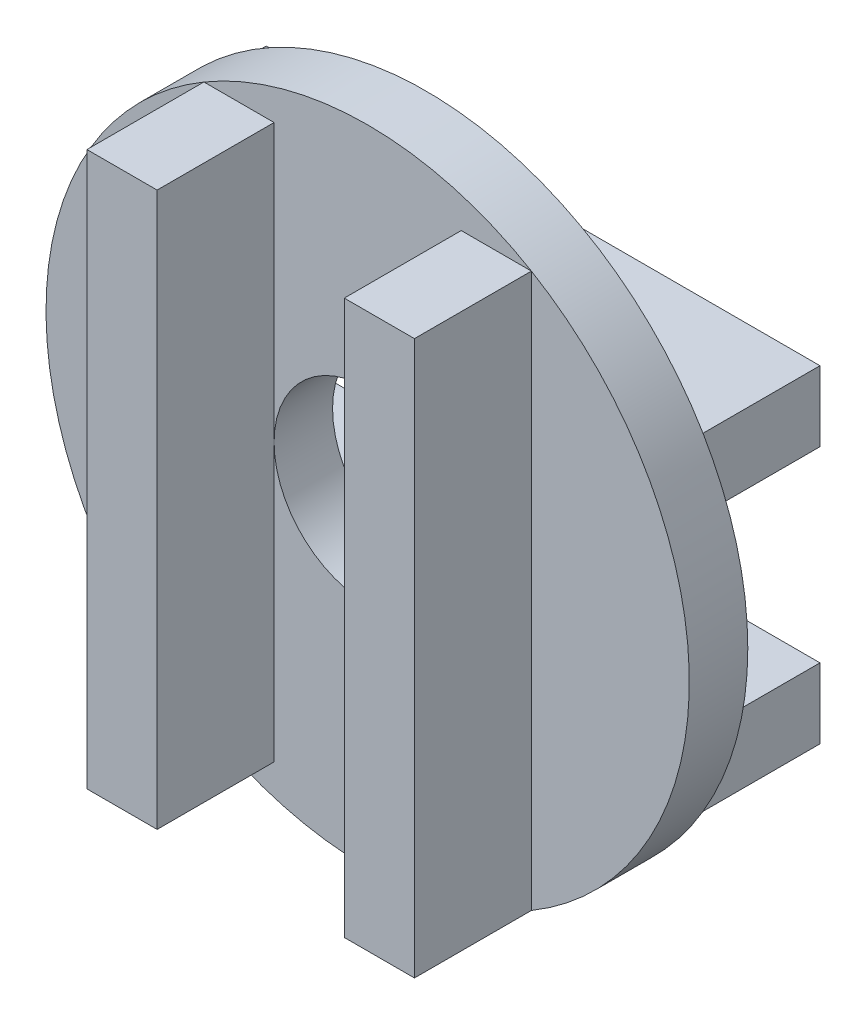
ISO-10303-21;
HEADER;
FILE_DESCRIPTION(('STEP AP214'),'2;1');
FILE_NAME('part.step','',(''),(''),'','','');
FILE_SCHEMA(('AUTOMOTIVE_DESIGN { 1 0 10303 214 1 1 1 1 }'));
ENDSEC;
DATA;
#1=APPLICATION_CONTEXT('core data for automotive mechanical design processes');
#2=APPLICATION_PROTOCOL_DEFINITION('international standard','automotive_design',2000,#1);
#3=PRODUCT_CONTEXT('',#1,'mechanical');
#4=PRODUCT('Part','Part','',(#3));
#5=PRODUCT_RELATED_PRODUCT_CATEGORY('part','',(#4));
#6=PRODUCT_DEFINITION_FORMATION('','',#4);
#7=PRODUCT_DEFINITION_CONTEXT('part definition',#1,'design');
#8=PRODUCT_DEFINITION('design','',#6,#7);
#9=PRODUCT_DEFINITION_SHAPE('','',#8);
#10=(LENGTH_UNIT() NAMED_UNIT(*) SI_UNIT(.MILLI.,.METRE.));
#11=(NAMED_UNIT(*) PLANE_ANGLE_UNIT() SI_UNIT($,.RADIAN.));
#12=(NAMED_UNIT(*) SI_UNIT($,.STERADIAN.) SOLID_ANGLE_UNIT());
#13=UNCERTAINTY_MEASURE_WITH_UNIT(LENGTH_MEASURE(1.E-05),#10,'distance_accuracy_value','');
#14=(GEOMETRIC_REPRESENTATION_CONTEXT(3) GLOBAL_UNCERTAINTY_ASSIGNED_CONTEXT((#13)) GLOBAL_UNIT_ASSIGNED_CONTEXT((#10,
#11,#12)) REPRESENTATION_CONTEXT('',''));
#15=CARTESIAN_POINT('',(0.,0.,0.));
#16=DIRECTION('',(0.,0.,1.));
#17=DIRECTION('',(1.,0.,0.));
#18=AXIS2_PLACEMENT_3D('',#15,#16,#17);
#19=CARTESIAN_POINT('',(0.,0.,0.));
#20=DIRECTION('',(0.,0.,1.));
#21=DIRECTION('',(1.,0.,0.));
#22=AXIS2_PLACEMENT_3D('',#19,#20,#21);
#23=PLANE('',#22);
#24=DIRECTION('',(0.,-1.,0.));
#25=VECTOR('',#24,1.);
#26=CARTESIAN_POINT('',(47.3392015141785,-28.,0.));
#27=LINE('',#26,#25);
#28=CARTESIAN_POINT('',(47.3392015141785,-16.,0.));
#29=VERTEX_POINT('',#28);
#30=CARTESIAN_POINT('',(47.3392015141785,-28.,0.));
#31=VERTEX_POINT('',#30);
#32=EDGE_CURVE('E173',#29,#31,#27,.T.);
#33=ORIENTED_EDGE('',*,*,#32,.F.);
#34=DIRECTION('',(1.,0.,0.));
#35=VECTOR('',#34,1.);
#36=CARTESIAN_POINT('',(47.3392015141785,-16.,0.));
#37=LINE('',#36,#35);
#38=CARTESIAN_POINT('',(0.,-16.,0.));
#39=VERTEX_POINT('',#38);
#40=EDGE_CURVE('E175',#39,#29,#37,.T.);
#41=ORIENTED_EDGE('',*,*,#40,.F.);
#42=CARTESIAN_POINT('',(0.,0.,0.));
#43=DIRECTION('',(0.,0.,1.));
#44=DIRECTION('',(1.,0.,0.));
#45=AXIS2_PLACEMENT_3D('',#42,#43,#44);
#46=CIRCLE('',#45,16.);
#47=CARTESIAN_POINT('',(0.,16.,0.));
#48=VERTEX_POINT('',#47);
#49=EDGE_CURVE('E352',#39,#48,#46,.T.);
#50=ORIENTED_EDGE('',*,*,#49,.T.);
#51=DIRECTION('',(-1.,0.,0.));
#52=VECTOR('',#51,1.);
#53=CARTESIAN_POINT('',(47.3392015141785,16.,0.));
#54=LINE('',#53,#52);
#55=CARTESIAN_POINT('',(47.3392015141785,16.,0.));
#56=VERTEX_POINT('',#55);
#57=EDGE_CURVE('E55',#56,#48,#54,.T.);
#58=ORIENTED_EDGE('',*,*,#57,.F.);
#59=DIRECTION('',(0.,-1.,0.));
#60=VECTOR('',#59,1.);
#61=CARTESIAN_POINT('',(47.3392015141785,28.,0.));
#62=LINE('',#61,#60);
#63=CARTESIAN_POINT('',(47.3392015141785,28.,0.));
#64=VERTEX_POINT('',#63);
#65=EDGE_CURVE('E184',#64,#56,#62,.T.);
#66=ORIENTED_EDGE('',*,*,#65,.F.);
#67=CARTESIAN_POINT('',(0.,0.,0.));
#68=DIRECTION('',(0.,0.,1.));
#69=DIRECTION('',(1.,0.,0.));
#70=AXIS2_PLACEMENT_3D('',#67,#68,#69);
#71=CIRCLE('',#70,55.);
#72=EDGE_CURVE('E178',#31,#64,#71,.T.);
#73=ORIENTED_EDGE('',*,*,#72,.F.);
#74=EDGE_LOOP('',(#33,#41,#50,#58,#66,#73));
#75=FACE_BOUND('',#74,.T.);
#76=ADVANCED_FACE('F43',(#75),#23,.F.);
#77=DIRECTION('',(-1.,0.,0.));
#78=VECTOR('',#77,1.);
#79=CARTESIAN_POINT('',(47.3392015141785,-28.,0.));
#80=LINE('',#79,#78);
#81=CARTESIAN_POINT('',(-47.3392015141785,-28.,0.));
#82=VERTEX_POINT('',#81);
#83=EDGE_CURVE('E69',#31,#82,#80,.T.);
#84=ORIENTED_EDGE('',*,*,#83,.F.);
#85=EDGE_CURVE('E386',#82,#31,#71,.T.);
#86=ORIENTED_EDGE('',*,*,#85,.F.);
#87=EDGE_LOOP('',(#84,#86));
#88=FACE_BOUND('',#87,.T.);
#89=ADVANCED_FACE('F413',(#88),#23,.F.);
#90=DIRECTION('',(0.,1.,0.));
#91=VECTOR('',#90,1.);
#92=CARTESIAN_POINT('',(-47.3392015141785,-28.,0.));
#93=LINE('',#92,#91);
#94=CARTESIAN_POINT('',(-47.3392015141785,-16.,0.));
#95=VERTEX_POINT('',#94);
#96=EDGE_CURVE('E211',#82,#95,#93,.T.);
#97=ORIENTED_EDGE('',*,*,#96,.F.);
#98=CARTESIAN_POINT('',(-47.3392015141785,28.,0.));
#99=VERTEX_POINT('',#98);
#100=EDGE_CURVE('E381',#99,#82,#71,.T.);
#101=ORIENTED_EDGE('',*,*,#100,.F.);
#102=DIRECTION('',(0.,1.,0.));
#103=VECTOR('',#102,1.);
#104=CARTESIAN_POINT('',(-47.3392015141785,28.,0.));
#105=LINE('',#104,#103);
#106=CARTESIAN_POINT('',(-47.3392015141785,16.,0.));
#107=VERTEX_POINT('',#106);
#108=EDGE_CURVE('E243',#107,#99,#105,.T.);
#109=ORIENTED_EDGE('',*,*,#108,.F.);
#110=EDGE_CURVE('E11',#48,#107,#54,.T.);
#111=ORIENTED_EDGE('',*,*,#110,.F.);
#112=EDGE_CURVE('E358',#48,#39,#46,.T.);
#113=ORIENTED_EDGE('',*,*,#112,.T.);
#114=EDGE_CURVE('E62',#95,#39,#37,.T.);
#115=ORIENTED_EDGE('',*,*,#114,.F.);
#116=EDGE_LOOP('',(#97,#101,#109,#111,#113,#115));
#117=FACE_BOUND('',#116,.T.);
#118=ADVANCED_FACE('F418',(#117),#23,.F.);
#119=DIRECTION('',(1.,0.,0.));
#120=VECTOR('',#119,1.);
#121=CARTESIAN_POINT('',(47.3392015141785,28.,0.));
#122=LINE('',#121,#120);
#123=EDGE_CURVE('E228',#99,#64,#122,.T.);
#124=ORIENTED_EDGE('',*,*,#123,.F.);
#125=EDGE_CURVE('E47',#64,#99,#71,.T.);
#126=ORIENTED_EDGE('',*,*,#125,.F.);
#127=EDGE_LOOP('',(#124,#126));
#128=FACE_BOUND('',#127,.T.);
#129=ADVANCED_FACE('F414',(#128),#23,.F.);
#130=CARTESIAN_POINT('',(0.,0.,10.));
#131=DIRECTION('',(0.,0.,1.));
#132=DIRECTION('',(1.,0.,0.));
#133=AXIS2_PLACEMENT_3D('',#130,#131,#132);
#134=PLANE('',#133);
#135=DIRECTION('',(-1.,0.,0.));
#136=VECTOR('',#135,1.);
#137=CARTESIAN_POINT('',(-16.,47.3392015141785,10.));
#138=LINE('',#137,#136);
#139=CARTESIAN_POINT('',(-16.,47.3392015141785,10.));
#140=VERTEX_POINT('',#139);
#141=CARTESIAN_POINT('',(-28.,47.3392015141785,10.));
#142=VERTEX_POINT('',#141);
#143=EDGE_CURVE('E289',#140,#142,#138,.T.);
#144=ORIENTED_EDGE('',*,*,#143,.F.);
#145=DIRECTION('',(0.,1.,0.));
#146=VECTOR('',#145,1.);
#147=CARTESIAN_POINT('',(-16.,47.3392015141785,10.));
#148=LINE('',#147,#146);
#149=CARTESIAN_POINT('',(-16.,0.,10.));
#150=VERTEX_POINT('',#149);
#151=EDGE_CURVE('E292',#150,#140,#148,.T.);
#152=ORIENTED_EDGE('',*,*,#151,.F.);
#153=CARTESIAN_POINT('',(0.,0.,10.));
#154=DIRECTION('',(0.,0.,1.));
#155=DIRECTION('',(1.,0.,0.));
#156=AXIS2_PLACEMENT_3D('',#153,#154,#155);
#157=CIRCLE('',#156,16.);
#158=CARTESIAN_POINT('',(16.,0.,10.));
#159=VERTEX_POINT('',#158);
#160=EDGE_CURVE('E353',#159,#150,#157,.T.);
#161=ORIENTED_EDGE('',*,*,#160,.F.);
#162=DIRECTION('',(0.,-1.,0.));
#163=VECTOR('',#162,1.);
#164=CARTESIAN_POINT('',(16.,47.3392015141785,10.));
#165=LINE('',#164,#163);
#166=CARTESIAN_POINT('',(16.,47.3392015141785,10.));
#167=VERTEX_POINT('',#166);
#168=EDGE_CURVE('E296',#167,#159,#165,.T.);
#169=ORIENTED_EDGE('',*,*,#168,.F.);
#170=DIRECTION('',(-1.,0.,0.));
#171=VECTOR('',#170,1.);
#172=CARTESIAN_POINT('',(16.,47.3392015141785,10.));
#173=LINE('',#172,#171);
#174=CARTESIAN_POINT('',(28.,47.3392015141785,10.));
#175=VERTEX_POINT('',#174);
#176=EDGE_CURVE('E313',#175,#167,#173,.T.);
#177=ORIENTED_EDGE('',*,*,#176,.F.);
#178=CARTESIAN_POINT('',(0.,0.,10.));
#179=DIRECTION('',(0.,0.,1.));
#180=DIRECTION('',(1.,0.,0.));
#181=AXIS2_PLACEMENT_3D('',#178,#179,#180);
#182=CIRCLE('',#181,55.);
#183=EDGE_CURVE('E360',#175,#142,#182,.T.);
#184=ORIENTED_EDGE('',*,*,#183,.T.);
#185=EDGE_LOOP('',(#144,#152,#161,#169,#177,#184));
#186=FACE_BOUND('',#185,.T.);
#187=ADVANCED_FACE('F421',(#186),#134,.T.);
#188=EDGE_CURVE('E357',#150,#159,#157,.T.);
#189=ORIENTED_EDGE('',*,*,#188,.F.);
#190=CARTESIAN_POINT('',(-16.,-47.3392015141785,10.));
#191=VERTEX_POINT('',#190);
#192=EDGE_CURVE('E293',#191,#150,#148,.T.);
#193=ORIENTED_EDGE('',*,*,#192,.F.);
#194=DIRECTION('',(1.,0.,0.));
#195=VECTOR('',#194,1.);
#196=CARTESIAN_POINT('',(-16.,-47.3392015141785,10.));
#197=LINE('',#196,#195);
#198=CARTESIAN_POINT('',(-28.,-47.3392015141785,10.));
#199=VERTEX_POINT('',#198);
#200=EDGE_CURVE('E281',#199,#191,#197,.T.);
#201=ORIENTED_EDGE('',*,*,#200,.F.);
#202=CARTESIAN_POINT('',(28.,-47.3392015141785,10.));
#203=VERTEX_POINT('',#202);
#204=EDGE_CURVE('E364',#199,#203,#182,.T.);
#205=ORIENTED_EDGE('',*,*,#204,.T.);
#206=DIRECTION('',(1.,0.,0.));
#207=VECTOR('',#206,1.);
#208=CARTESIAN_POINT('',(16.,-47.3392015141785,10.));
#209=LINE('',#208,#207);
#210=CARTESIAN_POINT('',(16.,-47.3392015141785,10.));
#211=VERTEX_POINT('',#210);
#212=EDGE_CURVE('E326',#211,#203,#209,.T.);
#213=ORIENTED_EDGE('',*,*,#212,.F.);
#214=EDGE_CURVE('E53',#159,#211,#165,.T.);
#215=ORIENTED_EDGE('',*,*,#214,.F.);
#216=EDGE_LOOP('',(#189,#193,#201,#205,#213,#215));
#217=FACE_BOUND('',#216,.T.);
#218=ADVANCED_FACE('F427',(#217),#134,.T.);
#219=EDGE_CURVE('E363',#142,#199,#182,.T.);
#220=ORIENTED_EDGE('',*,*,#219,.T.);
#221=DIRECTION('',(0.,-1.,0.));
#222=VECTOR('',#221,1.);
#223=CARTESIAN_POINT('',(-28.,47.3392015141785,10.));
#224=LINE('',#223,#222);
#225=EDGE_CURVE('E284',#142,#199,#224,.T.);
#226=ORIENTED_EDGE('',*,*,#225,.F.);
#227=EDGE_LOOP('',(#220,#226));
#228=FACE_BOUND('',#227,.T.);
#229=ADVANCED_FACE('F493',(#228),#134,.T.);
#230=DIRECTION('',(0.,1.,0.));
#231=VECTOR('',#230,1.);
#232=CARTESIAN_POINT('',(28.,47.3392015141785,10.));
#233=LINE('',#232,#231);
#234=EDGE_CURVE('E330',#203,#175,#233,.T.);
#235=ORIENTED_EDGE('',*,*,#234,.F.);
#236=EDGE_CURVE('E365',#203,#175,#182,.T.);
#237=ORIENTED_EDGE('',*,*,#236,.T.);
#238=EDGE_LOOP('',(#235,#237));
#239=FACE_BOUND('',#238,.T.);
#240=ADVANCED_FACE('F428',(#239),#134,.T.);
#241=CARTESIAN_POINT('',(0.,0.,10.));
#242=DIRECTION('',(0.,0.,-1.));
#243=DIRECTION('',(-1.,0.,0.));
#244=AXIS2_PLACEMENT_3D('',#241,#242,#243);
#245=CYLINDRICAL_SURFACE('',#244,55.);
#246=ORIENTED_EDGE('',*,*,#183,.F.);
#247=ORIENTED_EDGE('',*,*,#236,.F.);
#248=ORIENTED_EDGE('',*,*,#204,.F.);
#249=ORIENTED_EDGE('',*,*,#219,.F.);
#250=EDGE_LOOP('',(#246,#247,#248,#249));
#251=FACE_BOUND('',#250,.T.);
#252=ORIENTED_EDGE('',*,*,#125,.T.);
#253=ORIENTED_EDGE('',*,*,#100,.T.);
#254=ORIENTED_EDGE('',*,*,#85,.T.);
#255=ORIENTED_EDGE('',*,*,#72,.T.);
#256=EDGE_LOOP('',(#252,#253,#254,#255));
#257=FACE_BOUND('',#256,.T.);
#258=ADVANCED_FACE('F45',(#251,#257),#245,.T.);
#259=CARTESIAN_POINT('',(0.,0.,10.));
#260=DIRECTION('',(0.,0.,-1.));
#261=DIRECTION('',(-1.,0.,0.));
#262=AXIS2_PLACEMENT_3D('',#259,#260,#261);
#263=CYLINDRICAL_SURFACE('',#262,16.);
#264=ORIENTED_EDGE('',*,*,#160,.T.);
#265=ORIENTED_EDGE('',*,*,#188,.T.);
#266=EDGE_LOOP('',(#264,#265));
#267=FACE_BOUND('',#266,.T.);
#268=ORIENTED_EDGE('',*,*,#112,.F.);
#269=ORIENTED_EDGE('',*,*,#49,.F.);
#270=EDGE_LOOP('',(#268,#269));
#271=FACE_BOUND('',#270,.T.);
#272=ADVANCED_FACE('F473',(#267,#271),#263,.F.);
#273=CARTESIAN_POINT('',(16.,47.3392015141785,30.));
#274=DIRECTION('',(1.,0.,0.));
#275=DIRECTION('',(0.,0.,-1.));
#276=AXIS2_PLACEMENT_3D('',#273,#274,#275);
#277=PLANE('',#276);
#278=ORIENTED_EDGE('',*,*,#168,.T.);
#279=ORIENTED_EDGE('',*,*,#214,.T.);
#280=DIRECTION('',(0.,0.,-1.));
#281=VECTOR('',#280,1.);
#282=CARTESIAN_POINT('',(16.,-47.3392015141785,30.));
#283=LINE('',#282,#281);
#284=CARTESIAN_POINT('',(16.,-47.3392015141785,30.));
#285=VERTEX_POINT('',#284);
#286=EDGE_CURVE('E348',#285,#211,#283,.T.);
#287=ORIENTED_EDGE('',*,*,#286,.F.);
#288=DIRECTION('',(0.,-1.,0.));
#289=VECTOR('',#288,1.);
#290=CARTESIAN_POINT('',(16.,47.3392015141785,30.));
#291=LINE('',#290,#289);
#292=CARTESIAN_POINT('',(16.,47.3392015141785,30.));
#293=VERTEX_POINT('',#292);
#294=EDGE_CURVE('E308',#293,#285,#291,.T.);
#295=ORIENTED_EDGE('',*,*,#294,.F.);
#296=DIRECTION('',(0.,0.,-1.));
#297=VECTOR('',#296,1.);
#298=CARTESIAN_POINT('',(16.,47.3392015141785,30.));
#299=LINE('',#298,#297);
#300=EDGE_CURVE('E322',#293,#167,#299,.T.);
#301=ORIENTED_EDGE('',*,*,#300,.T.);
#302=EDGE_LOOP('',(#278,#279,#287,#295,#301));
#303=FACE_BOUND('',#302,.T.);
#304=ADVANCED_FACE('F475',(#303),#277,.F.);
#305=CARTESIAN_POINT('',(16.,-47.3392015141785,30.));
#306=DIRECTION('',(0.,1.,0.));
#307=DIRECTION('',(0.,0.,1.));
#308=AXIS2_PLACEMENT_3D('',#305,#306,#307);
#309=PLANE('',#308);
#310=ORIENTED_EDGE('',*,*,#212,.T.);
#311=DIRECTION('',(0.,0.,-1.));
#312=VECTOR('',#311,1.);
#313=CARTESIAN_POINT('',(28.,-47.3392015141785,30.));
#314=LINE('',#313,#312);
#315=CARTESIAN_POINT('',(28.,-47.3392015141785,30.));
#316=VERTEX_POINT('',#315);
#317=EDGE_CURVE('E344',#316,#203,#314,.T.);
#318=ORIENTED_EDGE('',*,*,#317,.F.);
#319=DIRECTION('',(1.,0.,0.));
#320=VECTOR('',#319,1.);
#321=CARTESIAN_POINT('',(16.,-47.3392015141785,30.));
#322=LINE('',#321,#320);
#323=EDGE_CURVE('E312',#285,#316,#322,.T.);
#324=ORIENTED_EDGE('',*,*,#323,.F.);
#325=ORIENTED_EDGE('',*,*,#286,.T.);
#326=EDGE_LOOP('',(#310,#318,#324,#325));
#327=FACE_BOUND('',#326,.T.);
#328=ADVANCED_FACE('F488',(#327),#309,.F.);
#329=CARTESIAN_POINT('',(28.,47.3392015141785,30.));
#330=DIRECTION('',(-1.,0.,0.));
#331=DIRECTION('',(0.,0.,1.));
#332=AXIS2_PLACEMENT_3D('',#329,#330,#331);
#333=PLANE('',#332);
#334=ORIENTED_EDGE('',*,*,#234,.T.);
#335=DIRECTION('',(0.,0.,-1.));
#336=VECTOR('',#335,1.);
#337=CARTESIAN_POINT('',(28.,47.3392015141785,30.));
#338=LINE('',#337,#336);
#339=CARTESIAN_POINT('',(28.,47.3392015141785,30.));
#340=VERTEX_POINT('',#339);
#341=EDGE_CURVE('E340',#340,#175,#338,.T.);
#342=ORIENTED_EDGE('',*,*,#341,.F.);
#343=DIRECTION('',(0.,1.,0.));
#344=VECTOR('',#343,1.);
#345=CARTESIAN_POINT('',(28.,47.3392015141785,30.));
#346=LINE('',#345,#344);
#347=EDGE_CURVE('E316',#316,#340,#346,.T.);
#348=ORIENTED_EDGE('',*,*,#347,.F.);
#349=ORIENTED_EDGE('',*,*,#317,.T.);
#350=EDGE_LOOP('',(#334,#342,#348,#349));
#351=FACE_BOUND('',#350,.T.);
#352=ADVANCED_FACE('F485',(#351),#333,.F.);
#353=CARTESIAN_POINT('',(16.,47.3392015141785,30.));
#354=DIRECTION('',(0.,-1.,0.));
#355=DIRECTION('',(0.,0.,-1.));
#356=AXIS2_PLACEMENT_3D('',#353,#354,#355);
#357=PLANE('',#356);
#358=ORIENTED_EDGE('',*,*,#176,.T.);
#359=ORIENTED_EDGE('',*,*,#300,.F.);
#360=DIRECTION('',(-1.,0.,0.));
#361=VECTOR('',#360,1.);
#362=CARTESIAN_POINT('',(16.,47.3392015141785,30.));
#363=LINE('',#362,#361);
#364=EDGE_CURVE('E319',#340,#293,#363,.T.);
#365=ORIENTED_EDGE('',*,*,#364,.F.);
#366=ORIENTED_EDGE('',*,*,#341,.T.);
#367=EDGE_LOOP('',(#358,#359,#365,#366));
#368=FACE_BOUND('',#367,.T.);
#369=ADVANCED_FACE('F481',(#368),#357,.F.);
#370=CARTESIAN_POINT('',(0.,0.,30.));
#371=DIRECTION('',(0.,0.,1.));
#372=DIRECTION('',(1.,0.,0.));
#373=AXIS2_PLACEMENT_3D('',#370,#371,#372);
#374=PLANE('',#373);
#375=ORIENTED_EDGE('',*,*,#294,.T.);
#376=ORIENTED_EDGE('',*,*,#323,.T.);
#377=ORIENTED_EDGE('',*,*,#347,.T.);
#378=ORIENTED_EDGE('',*,*,#364,.T.);
#379=EDGE_LOOP('',(#375,#376,#377,#378));
#380=FACE_BOUND('',#379,.T.);
#381=ADVANCED_FACE('F508',(#380),#374,.T.);
#382=CARTESIAN_POINT('',(-16.,47.3392015141785,30.));
#383=DIRECTION('',(-1.,0.,0.));
#384=DIRECTION('',(0.,0.,1.));
#385=AXIS2_PLACEMENT_3D('',#382,#383,#384);
#386=PLANE('',#385);
#387=ORIENTED_EDGE('',*,*,#192,.T.);
#388=ORIENTED_EDGE('',*,*,#151,.T.);
#389=DIRECTION('',(0.,0.,-1.));
#390=VECTOR('',#389,1.);
#391=CARTESIAN_POINT('',(-16.,47.3392015141785,30.));
#392=LINE('',#391,#390);
#393=CARTESIAN_POINT('',(-16.,47.3392015141785,30.));
#394=VERTEX_POINT('',#393);
#395=EDGE_CURVE('E265',#394,#140,#392,.T.);
#396=ORIENTED_EDGE('',*,*,#395,.F.);
#397=DIRECTION('',(0.,1.,0.));
#398=VECTOR('',#397,1.);
#399=CARTESIAN_POINT('',(-16.,47.3392015141785,30.));
#400=LINE('',#399,#398);
#401=CARTESIAN_POINT('',(-16.,-47.3392015141785,30.));
#402=VERTEX_POINT('',#401);
#403=EDGE_CURVE('E285',#402,#394,#400,.T.);
#404=ORIENTED_EDGE('',*,*,#403,.F.);
#405=DIRECTION('',(0.,0.,-1.));
#406=VECTOR('',#405,1.);
#407=CARTESIAN_POINT('',(-16.,-47.3392015141785,30.));
#408=LINE('',#407,#406);
#409=EDGE_CURVE('E276',#402,#191,#408,.T.);
#410=ORIENTED_EDGE('',*,*,#409,.T.);
#411=EDGE_LOOP('',(#387,#388,#396,#404,#410));
#412=FACE_BOUND('',#411,.T.);
#413=ADVANCED_FACE('F454',(#412),#386,.F.);
#414=CARTESIAN_POINT('',(-16.,47.3392015141785,30.));
#415=DIRECTION('',(0.,-1.,0.));
#416=DIRECTION('',(0.,0.,-1.));
#417=AXIS2_PLACEMENT_3D('',#414,#415,#416);
#418=PLANE('',#417);
#419=ORIENTED_EDGE('',*,*,#143,.T.);
#420=DIRECTION('',(0.,0.,-1.));
#421=VECTOR('',#420,1.);
#422=CARTESIAN_POINT('',(-28.,47.3392015141785,30.));
#423=LINE('',#422,#421);
#424=CARTESIAN_POINT('',(-28.,47.3392015141785,30.));
#425=VERTEX_POINT('',#424);
#426=EDGE_CURVE('E269',#425,#142,#423,.T.);
#427=ORIENTED_EDGE('',*,*,#426,.F.);
#428=DIRECTION('',(-1.,0.,0.));
#429=VECTOR('',#428,1.);
#430=CARTESIAN_POINT('',(-16.,47.3392015141785,30.));
#431=LINE('',#430,#429);
#432=EDGE_CURVE('E302',#394,#425,#431,.T.);
#433=ORIENTED_EDGE('',*,*,#432,.F.);
#434=ORIENTED_EDGE('',*,*,#395,.T.);
#435=EDGE_LOOP('',(#419,#427,#433,#434));
#436=FACE_BOUND('',#435,.T.);
#437=ADVANCED_FACE('F460',(#436),#418,.F.);
#438=CARTESIAN_POINT('',(-28.,47.3392015141785,30.));
#439=DIRECTION('',(1.,0.,0.));
#440=DIRECTION('',(0.,0.,-1.));
#441=AXIS2_PLACEMENT_3D('',#438,#439,#440);
#442=PLANE('',#441);
#443=ORIENTED_EDGE('',*,*,#225,.T.);
#444=DIRECTION('',(0.,0.,-1.));
#445=VECTOR('',#444,1.);
#446=CARTESIAN_POINT('',(-28.,-47.3392015141785,30.));
#447=LINE('',#446,#445);
#448=CARTESIAN_POINT('',(-28.,-47.3392015141785,30.));
#449=VERTEX_POINT('',#448);
#450=EDGE_CURVE('E273',#449,#199,#447,.T.);
#451=ORIENTED_EDGE('',*,*,#450,.F.);
#452=DIRECTION('',(0.,-1.,0.));
#453=VECTOR('',#452,1.);
#454=CARTESIAN_POINT('',(-28.,47.3392015141785,30.));
#455=LINE('',#454,#453);
#456=EDGE_CURVE('E299',#425,#449,#455,.T.);
#457=ORIENTED_EDGE('',*,*,#456,.F.);
#458=ORIENTED_EDGE('',*,*,#426,.T.);
#459=EDGE_LOOP('',(#443,#451,#457,#458));
#460=FACE_BOUND('',#459,.T.);
#461=ADVANCED_FACE('F496',(#460),#442,.F.);
#462=CARTESIAN_POINT('',(-16.,-47.3392015141785,30.));
#463=DIRECTION('',(0.,1.,0.));
#464=DIRECTION('',(0.,0.,1.));
#465=AXIS2_PLACEMENT_3D('',#462,#463,#464);
#466=PLANE('',#465);
#467=ORIENTED_EDGE('',*,*,#200,.T.);
#468=ORIENTED_EDGE('',*,*,#409,.F.);
#469=DIRECTION('',(1.,0.,0.));
#470=VECTOR('',#469,1.);
#471=CARTESIAN_POINT('',(-16.,-47.3392015141785,30.));
#472=LINE('',#471,#470);
#473=EDGE_CURVE('E280',#449,#402,#472,.T.);
#474=ORIENTED_EDGE('',*,*,#473,.F.);
#475=ORIENTED_EDGE('',*,*,#450,.T.);
#476=EDGE_LOOP('',(#467,#468,#474,#475));
#477=FACE_BOUND('',#476,.T.);
#478=ADVANCED_FACE('F497',(#477),#466,.F.);
#479=CARTESIAN_POINT('',(0.,0.,30.));
#480=DIRECTION('',(0.,0.,-1.));
#481=DIRECTION('',(-1.,0.,0.));
#482=AXIS2_PLACEMENT_3D('',#479,#480,#481);
#483=PLANE('',#482);
#484=ORIENTED_EDGE('',*,*,#403,.T.);
#485=ORIENTED_EDGE('',*,*,#432,.T.);
#486=ORIENTED_EDGE('',*,*,#456,.T.);
#487=ORIENTED_EDGE('',*,*,#473,.T.);
#488=EDGE_LOOP('',(#484,#485,#486,#487));
#489=FACE_BOUND('',#488,.T.);
#490=ADVANCED_FACE('F464',(#489),#483,.F.);
#491=CARTESIAN_POINT('',(47.3392015141785,28.,-20.));
#492=DIRECTION('',(-1.,0.,0.));
#493=DIRECTION('',(0.,0.,1.));
#494=AXIS2_PLACEMENT_3D('',#491,#492,#493);
#495=PLANE('',#494);
#496=ORIENTED_EDGE('',*,*,#65,.T.);
#497=DIRECTION('',(0.,0.,1.));
#498=VECTOR('',#497,1.);
#499=CARTESIAN_POINT('',(47.3392015141785,16.,-20.));
#500=LINE('',#499,#498);
#501=CARTESIAN_POINT('',(47.3392015141785,16.,-20.));
#502=VERTEX_POINT('',#501);
#503=EDGE_CURVE('E261',#502,#56,#500,.T.);
#504=ORIENTED_EDGE('',*,*,#503,.F.);
#505=DIRECTION('',(0.,-1.,0.));
#506=VECTOR('',#505,1.);
#507=CARTESIAN_POINT('',(47.3392015141785,28.,-20.));
#508=LINE('',#507,#506);
#509=CARTESIAN_POINT('',(47.3392015141785,28.,-20.));
#510=VERTEX_POINT('',#509);
#511=EDGE_CURVE('E223',#510,#502,#508,.T.);
#512=ORIENTED_EDGE('',*,*,#511,.F.);
#513=DIRECTION('',(0.,0.,1.));
#514=VECTOR('',#513,1.);
#515=CARTESIAN_POINT('',(47.3392015141785,28.,-20.));
#516=LINE('',#515,#514);
#517=EDGE_CURVE('E237',#510,#64,#516,.T.);
#518=ORIENTED_EDGE('',*,*,#517,.T.);
#519=EDGE_LOOP('',(#496,#504,#512,#518));
#520=FACE_BOUND('',#519,.T.);
#521=ADVANCED_FACE('F446',(#520),#495,.F.);
#522=CARTESIAN_POINT('',(47.3392015141785,16.,-20.));
#523=DIRECTION('',(0.,1.,0.));
#524=DIRECTION('',(-1.,0.,0.));
#525=AXIS2_PLACEMENT_3D('',#522,#523,#524);
#526=PLANE('',#525);
#527=ORIENTED_EDGE('',*,*,#57,.T.);
#528=ORIENTED_EDGE('',*,*,#110,.T.);
#529=DIRECTION('',(0.,0.,1.));
#530=VECTOR('',#529,1.);
#531=CARTESIAN_POINT('',(-47.3392015141785,16.,-20.));
#532=LINE('',#531,#530);
#533=CARTESIAN_POINT('',(-47.3392015141785,16.,-20.));
#534=VERTEX_POINT('',#533);
#535=EDGE_CURVE('E257',#534,#107,#532,.T.);
#536=ORIENTED_EDGE('',*,*,#535,.F.);
#537=DIRECTION('',(-1.,0.,0.));
#538=VECTOR('',#537,1.);
#539=CARTESIAN_POINT('',(47.3392015141785,16.,-20.));
#540=LINE('',#539,#538);
#541=EDGE_CURVE('E227',#502,#534,#540,.T.);
#542=ORIENTED_EDGE('',*,*,#541,.F.);
#543=ORIENTED_EDGE('',*,*,#503,.T.);
#544=EDGE_LOOP('',(#527,#528,#536,#542,#543));
#545=FACE_BOUND('',#544,.T.);
#546=ADVANCED_FACE('F437',(#545),#526,.F.);
#547=CARTESIAN_POINT('',(-47.3392015141785,28.,-20.));
#548=DIRECTION('',(1.,0.,0.));
#549=DIRECTION('',(0.,0.,-1.));
#550=AXIS2_PLACEMENT_3D('',#547,#548,#549);
#551=PLANE('',#550);
#552=ORIENTED_EDGE('',*,*,#108,.T.);
#553=DIRECTION('',(0.,0.,1.));
#554=VECTOR('',#553,1.);
#555=CARTESIAN_POINT('',(-47.3392015141785,28.,-20.));
#556=LINE('',#555,#554);
#557=CARTESIAN_POINT('',(-47.3392015141785,28.,-20.));
#558=VERTEX_POINT('',#557);
#559=EDGE_CURVE('E253',#558,#99,#556,.T.);
#560=ORIENTED_EDGE('',*,*,#559,.F.);
#561=DIRECTION('',(0.,1.,0.));
#562=VECTOR('',#561,1.);
#563=CARTESIAN_POINT('',(-47.3392015141785,28.,-20.));
#564=LINE('',#563,#562);
#565=EDGE_CURVE('E231',#534,#558,#564,.T.);
#566=ORIENTED_EDGE('',*,*,#565,.F.);
#567=ORIENTED_EDGE('',*,*,#535,.T.);
#568=EDGE_LOOP('',(#552,#560,#566,#567));
#569=FACE_BOUND('',#568,.T.);
#570=ADVANCED_FACE('F439',(#569),#551,.F.);
#571=CARTESIAN_POINT('',(47.3392015141785,28.,-20.));
#572=DIRECTION('',(0.,-1.,0.));
#573=DIRECTION('',(1.,0.,0.));
#574=AXIS2_PLACEMENT_3D('',#571,#572,#573);
#575=PLANE('',#574);
#576=ORIENTED_EDGE('',*,*,#123,.T.);
#577=ORIENTED_EDGE('',*,*,#517,.F.);
#578=DIRECTION('',(1.,0.,0.));
#579=VECTOR('',#578,1.);
#580=CARTESIAN_POINT('',(47.3392015141785,28.,-20.));
#581=LINE('',#580,#579);
#582=EDGE_CURVE('E234',#558,#510,#581,.T.);
#583=ORIENTED_EDGE('',*,*,#582,.F.);
#584=ORIENTED_EDGE('',*,*,#559,.T.);
#585=EDGE_LOOP('',(#576,#577,#583,#584));
#586=FACE_BOUND('',#585,.T.);
#587=ADVANCED_FACE('F668',(#586),#575,.F.);
#588=CARTESIAN_POINT('',(0.,0.,-20.));
#589=DIRECTION('',(0.,0.,-1.));
#590=DIRECTION('',(-1.,0.,0.));
#591=AXIS2_PLACEMENT_3D('',#588,#589,#590);
#592=PLANE('',#591);
#593=ORIENTED_EDGE('',*,*,#511,.T.);
#594=ORIENTED_EDGE('',*,*,#541,.T.);
#595=ORIENTED_EDGE('',*,*,#565,.T.);
#596=ORIENTED_EDGE('',*,*,#582,.T.);
#597=EDGE_LOOP('',(#593,#594,#595,#596));
#598=FACE_BOUND('',#597,.T.);
#599=ADVANCED_FACE('F442',(#598),#592,.T.);
#600=CARTESIAN_POINT('',(47.3392015141785,-28.,-20.));
#601=DIRECTION('',(-1.,0.,0.));
#602=DIRECTION('',(0.,0.,1.));
#603=AXIS2_PLACEMENT_3D('',#600,#601,#602);
#604=PLANE('',#603);
#605=ORIENTED_EDGE('',*,*,#32,.T.);
#606=DIRECTION('',(0.,0.,1.));
#607=VECTOR('',#606,1.);
#608=CARTESIAN_POINT('',(47.3392015141785,-28.,-20.));
#609=LINE('',#608,#607);
#610=CARTESIAN_POINT('',(47.3392015141785,-28.,-20.));
#611=VERTEX_POINT('',#610);
#612=EDGE_CURVE('E392',#611,#31,#609,.T.);
#613=ORIENTED_EDGE('',*,*,#612,.F.);
#614=DIRECTION('',(0.,-1.,0.));
#615=VECTOR('',#614,1.);
#616=CARTESIAN_POINT('',(47.3392015141785,-28.,-20.));
#617=LINE('',#616,#615);
#618=CARTESIAN_POINT('',(47.3392015141785,-16.,-20.));
#619=VERTEX_POINT('',#618);
#620=EDGE_CURVE('E194',#619,#611,#617,.T.);
#621=ORIENTED_EDGE('',*,*,#620,.F.);
#622=DIRECTION('',(0.,0.,1.));
#623=VECTOR('',#622,1.);
#624=CARTESIAN_POINT('',(47.3392015141785,-16.,-20.));
#625=LINE('',#624,#623);
#626=EDGE_CURVE('E190',#619,#29,#625,.T.);
#627=ORIENTED_EDGE('',*,*,#626,.T.);
#628=EDGE_LOOP('',(#605,#613,#621,#627));
#629=FACE_BOUND('',#628,.T.);
#630=ADVANCED_FACE('F196',(#629),#604,.F.);
#631=CARTESIAN_POINT('',(47.3392015141785,-28.,-20.));
#632=DIRECTION('',(0.,1.,0.));
#633=DIRECTION('',(-1.,0.,0.));
#634=AXIS2_PLACEMENT_3D('',#631,#632,#633);
#635=PLANE('',#634);
#636=ORIENTED_EDGE('',*,*,#83,.T.);
#637=DIRECTION('',(0.,0.,1.));
#638=VECTOR('',#637,1.);
#639=CARTESIAN_POINT('',(-47.3392015141785,-28.,-20.));
#640=LINE('',#639,#638);
#641=CARTESIAN_POINT('',(-47.3392015141785,-28.,-20.));
#642=VERTEX_POINT('',#641);
#643=EDGE_CURVE('E206',#642,#82,#640,.T.);
#644=ORIENTED_EDGE('',*,*,#643,.F.);
#645=DIRECTION('',(-1.,0.,0.));
#646=VECTOR('',#645,1.);
#647=CARTESIAN_POINT('',(47.3392015141785,-28.,-20.));
#648=LINE('',#647,#646);
#649=EDGE_CURVE('E218',#611,#642,#648,.T.);
#650=ORIENTED_EDGE('',*,*,#649,.F.);
#651=ORIENTED_EDGE('',*,*,#612,.T.);
#652=EDGE_LOOP('',(#636,#644,#650,#651));
#653=FACE_BOUND('',#652,.T.);
#654=ADVANCED_FACE('F393',(#653),#635,.F.);
#655=CARTESIAN_POINT('',(-47.3392015141785,-28.,-20.));
#656=DIRECTION('',(1.,0.,0.));
#657=DIRECTION('',(0.,0.,-1.));
#658=AXIS2_PLACEMENT_3D('',#655,#656,#657);
#659=PLANE('',#658);
#660=ORIENTED_EDGE('',*,*,#96,.T.);
#661=DIRECTION('',(0.,0.,1.));
#662=VECTOR('',#661,1.);
#663=CARTESIAN_POINT('',(-47.3392015141785,-16.,-20.));
#664=LINE('',#663,#662);
#665=CARTESIAN_POINT('',(-47.3392015141785,-16.,-20.));
#666=VERTEX_POINT('',#665);
#667=EDGE_CURVE('E200',#666,#95,#664,.T.);
#668=ORIENTED_EDGE('',*,*,#667,.F.);
#669=DIRECTION('',(0.,1.,0.));
#670=VECTOR('',#669,1.);
#671=CARTESIAN_POINT('',(-47.3392015141785,-28.,-20.));
#672=LINE('',#671,#670);
#673=EDGE_CURVE('E204',#642,#666,#672,.T.);
#674=ORIENTED_EDGE('',*,*,#673,.F.);
#675=ORIENTED_EDGE('',*,*,#643,.T.);
#676=EDGE_LOOP('',(#660,#668,#674,#675));
#677=FACE_BOUND('',#676,.T.);
#678=ADVANCED_FACE('F401',(#677),#659,.F.);
#679=CARTESIAN_POINT('',(47.3392015141785,-16.,-20.));
#680=DIRECTION('',(0.,-1.,0.));
#681=DIRECTION('',(1.,0.,0.));
#682=AXIS2_PLACEMENT_3D('',#679,#680,#681);
#683=PLANE('',#682);
#684=ORIENTED_EDGE('',*,*,#114,.T.);
#685=ORIENTED_EDGE('',*,*,#40,.T.);
#686=ORIENTED_EDGE('',*,*,#626,.F.);
#687=DIRECTION('',(1.,0.,0.));
#688=VECTOR('',#687,1.);
#689=CARTESIAN_POINT('',(47.3392015141785,-16.,-20.));
#690=LINE('',#689,#688);
#691=EDGE_CURVE('E199',#666,#619,#690,.T.);
#692=ORIENTED_EDGE('',*,*,#691,.F.);
#693=ORIENTED_EDGE('',*,*,#667,.T.);
#694=EDGE_LOOP('',(#684,#685,#686,#692,#693));
#695=FACE_BOUND('',#694,.T.);
#696=ADVANCED_FACE('F188',(#695),#683,.F.);
#697=CARTESIAN_POINT('',(0.,0.,-20.));
#698=DIRECTION('',(0.,0.,1.));
#699=DIRECTION('',(1.,0.,0.));
#700=AXIS2_PLACEMENT_3D('',#697,#698,#699);
#701=PLANE('',#700);
#702=ORIENTED_EDGE('',*,*,#620,.T.);
#703=ORIENTED_EDGE('',*,*,#649,.T.);
#704=ORIENTED_EDGE('',*,*,#673,.T.);
#705=ORIENTED_EDGE('',*,*,#691,.T.);
#706=EDGE_LOOP('',(#702,#703,#704,#705));
#707=FACE_BOUND('',#706,.T.);
#708=ADVANCED_FACE('F404',(#707),#701,.F.);
#709=CLOSED_SHELL('',(#76,#89,#118,#129,#187,#218,#229,#240,#258,#272,#304,#328,#352,#369,#381,
#413,#437,#461,#478,#490,#521,#546,#570,#587,#599,#630,#654,#678,#696,#708));
#710=MANIFOLD_SOLID_BREP('B2',#709);
#711=ADVANCED_BREP_SHAPE_REPRESENTATION('',(#18,#710),#14);
#712=SHAPE_DEFINITION_REPRESENTATION(#9,#711);
ENDSEC;
END-ISO-10303-21;
